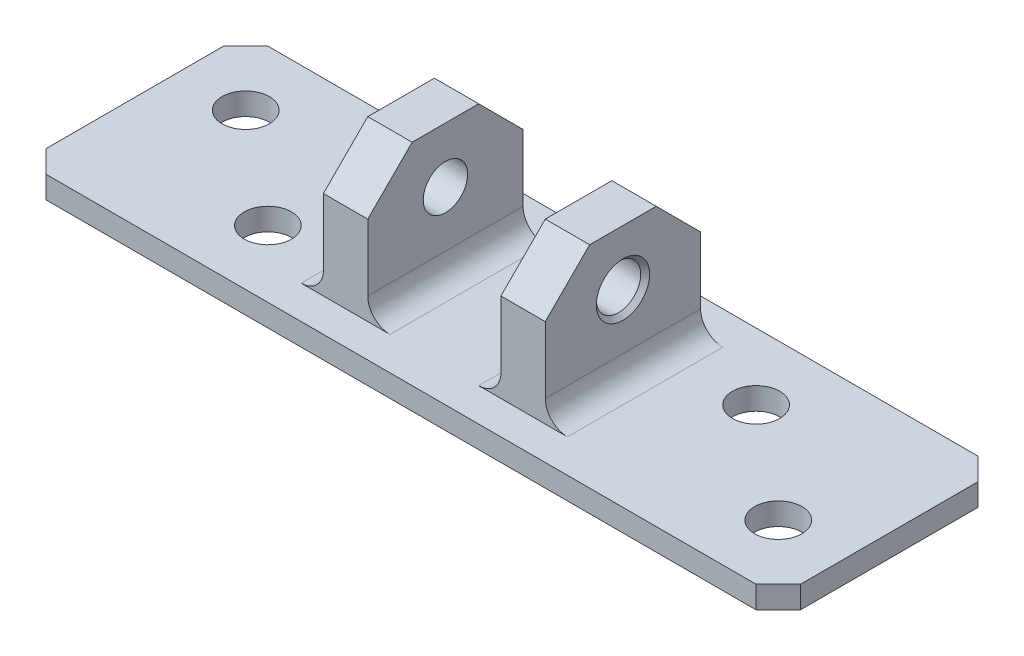
ISO-10303-21;
HEADER;
FILE_DESCRIPTION(('STEP AP214'),'2;1');
FILE_NAME('part.step','',(''),(''),'','','');
FILE_SCHEMA(('AUTOMOTIVE_DESIGN { 1 0 10303 214 1 1 1 1 }'));
ENDSEC;
DATA;
#1=APPLICATION_CONTEXT('core data for automotive mechanical design processes');
#2=APPLICATION_PROTOCOL_DEFINITION('international standard','automotive_design',2000,#1);
#3=PRODUCT_CONTEXT('',#1,'mechanical');
#4=PRODUCT('Part','Part','',(#3));
#5=PRODUCT_RELATED_PRODUCT_CATEGORY('part','',(#4));
#6=PRODUCT_DEFINITION_FORMATION('','',#4);
#7=PRODUCT_DEFINITION_CONTEXT('part definition',#1,'design');
#8=PRODUCT_DEFINITION('design','',#6,#7);
#9=PRODUCT_DEFINITION_SHAPE('','',#8);
#10=(LENGTH_UNIT() NAMED_UNIT(*) SI_UNIT(.MILLI.,.METRE.));
#11=(NAMED_UNIT(*) PLANE_ANGLE_UNIT() SI_UNIT($,.RADIAN.));
#12=(NAMED_UNIT(*) SI_UNIT($,.STERADIAN.) SOLID_ANGLE_UNIT());
#13=UNCERTAINTY_MEASURE_WITH_UNIT(LENGTH_MEASURE(1.E-05),#10,'distance_accuracy_value','');
#14=(GEOMETRIC_REPRESENTATION_CONTEXT(3) GLOBAL_UNCERTAINTY_ASSIGNED_CONTEXT((#13)) GLOBAL_UNIT_ASSIGNED_CONTEXT((#10,
#11,#12)) REPRESENTATION_CONTEXT('',''));
#15=CARTESIAN_POINT('',(0.,0.,0.));
#16=DIRECTION('',(0.,0.,1.));
#17=DIRECTION('',(1.,0.,0.));
#18=AXIS2_PLACEMENT_3D('',#15,#16,#17);
#19=CARTESIAN_POINT('',(0.,1.5875,0.));
#20=DIRECTION('',(0.,1.,0.));
#21=DIRECTION('',(0.,0.,1.));
#22=AXIS2_PLACEMENT_3D('',#19,#20,#21);
#23=PLANE('',#22);
#24=CARTESIAN_POINT('',(-44.45,1.5875,-6.35));
#25=DIRECTION('',(0.,1.,0.));
#26=DIRECTION('',(0.,0.,1.));
#27=AXIS2_PLACEMENT_3D('',#24,#25,#26);
#28=CIRCLE('',#27,3.3782);
#29=CARTESIAN_POINT('',(-44.45,1.5875,-2.9718));
#30=VERTEX_POINT('',#29);
#31=EDGE_CURVE('E399',#30,#30,#28,.T.);
#32=ORIENTED_EDGE('',*,*,#31,.F.);
#33=EDGE_LOOP('',(#32));
#34=FACE_BOUND('',#33,.T.);
#35=CARTESIAN_POINT('',(28.575,1.5875,-6.35000000000008));
#36=DIRECTION('',(0.,1.,0.));
#37=DIRECTION('',(0.,0.,1.));
#38=AXIS2_PLACEMENT_3D('',#35,#36,#37);
#39=CIRCLE('',#38,3.3782);
#40=CARTESIAN_POINT('',(28.575,1.5875,-2.97180000000008));
#41=VERTEX_POINT('',#40);
#42=EDGE_CURVE('E405',#41,#41,#39,.T.);
#43=ORIENTED_EDGE('',*,*,#42,.F.);
#44=EDGE_LOOP('',(#43));
#45=FACE_BOUND('',#44,.T.);
#46=CARTESIAN_POINT('',(-28.575,1.5875,6.35));
#47=DIRECTION('',(0.,1.,0.));
#48=DIRECTION('',(0.,0.,1.));
#49=AXIS2_PLACEMENT_3D('',#46,#47,#48);
#50=CIRCLE('',#49,3.3782);
#51=CARTESIAN_POINT('',(-28.575,1.5875,9.7282));
#52=VERTEX_POINT('',#51);
#53=EDGE_CURVE('E411',#52,#52,#50,.T.);
#54=ORIENTED_EDGE('',*,*,#53,.F.);
#55=EDGE_LOOP('',(#54));
#56=FACE_BOUND('',#55,.T.);
#57=CARTESIAN_POINT('',(44.45,1.5875,6.34999999999997));
#58=DIRECTION('',(0.,1.,0.));
#59=DIRECTION('',(0.,0.,1.));
#60=AXIS2_PLACEMENT_3D('',#57,#58,#59);
#61=CIRCLE('',#60,3.3782);
#62=CARTESIAN_POINT('',(44.45,1.5875,9.72819999999997));
#63=VERTEX_POINT('',#62);
#64=EDGE_CURVE('E417',#63,#63,#61,.T.);
#65=ORIENTED_EDGE('',*,*,#64,.F.);
#66=EDGE_LOOP('',(#65));
#67=FACE_BOUND('',#66,.T.);
#68=DIRECTION('',(0.,0.,1.));
#69=VECTOR('',#68,1.);
#70=CARTESIAN_POINT('',(-53.975,1.5875,15.875));
#71=LINE('',#70,#69);
#72=CARTESIAN_POINT('',(-53.975,1.5875,-12.7));
#73=VERTEX_POINT('',#72);
#74=CARTESIAN_POINT('',(-53.975,1.5875,12.7));
#75=VERTEX_POINT('',#74);
#76=EDGE_CURVE('E234',#73,#75,#71,.T.);
#77=ORIENTED_EDGE('',*,*,#76,.T.);
#78=DIRECTION('',(-0.707106781186546,0.,-0.707106781186549));
#79=VECTOR('',#78,1.);
#80=CARTESIAN_POINT('',(-33.3375000000001,1.5875,33.3375));
#81=LINE('',#80,#79);
#82=CARTESIAN_POINT('',(-50.8,1.5875,15.875));
#83=VERTEX_POINT('',#82);
#84=EDGE_CURVE('E249',#75,#83,#81,.F.);
#85=ORIENTED_EDGE('',*,*,#84,.T.);
#86=DIRECTION('',(1.,0.,0.));
#87=VECTOR('',#86,1.);
#88=CARTESIAN_POINT('',(53.975,1.5875,15.875));
#89=LINE('',#88,#87);
#90=CARTESIAN_POINT('',(50.8,1.5875,15.875));
#91=VERTEX_POINT('',#90);
#92=EDGE_CURVE('E215',#83,#91,#89,.T.);
#93=ORIENTED_EDGE('',*,*,#92,.T.);
#94=DIRECTION('',(-0.707106781186549,0.,0.707106781186546));
#95=VECTOR('',#94,1.);
#96=CARTESIAN_POINT('',(33.3374999999999,1.5875,33.3375));
#97=LINE('',#96,#95);
#98=CARTESIAN_POINT('',(53.975,1.5875,12.7));
#99=VERTEX_POINT('',#98);
#100=EDGE_CURVE('E245',#91,#99,#97,.F.);
#101=ORIENTED_EDGE('',*,*,#100,.T.);
#102=DIRECTION('',(0.,0.,-1.));
#103=VECTOR('',#102,1.);
#104=CARTESIAN_POINT('',(53.975,1.5875,15.875));
#105=LINE('',#104,#103);
#106=CARTESIAN_POINT('',(53.975,1.5875,-12.7));
#107=VERTEX_POINT('',#106);
#108=EDGE_CURVE('E425',#99,#107,#105,.T.);
#109=ORIENTED_EDGE('',*,*,#108,.T.);
#110=DIRECTION('',(0.707106781186544,0.,0.707106781186551));
#111=VECTOR('',#110,1.);
#112=CARTESIAN_POINT('',(33.3375000000002,1.5875,-33.3374999999999));
#113=LINE('',#112,#111);
#114=CARTESIAN_POINT('',(50.8,1.5875,-15.875));
#115=VERTEX_POINT('',#114);
#116=EDGE_CURVE('E243',#107,#115,#113,.F.);
#117=ORIENTED_EDGE('',*,*,#116,.T.);
#118=DIRECTION('',(-1.,0.,0.));
#119=VECTOR('',#118,1.);
#120=CARTESIAN_POINT('',(53.975,1.5875,-15.875));
#121=LINE('',#120,#119);
#122=CARTESIAN_POINT('',(-50.8,1.5875,-15.875));
#123=VERTEX_POINT('',#122);
#124=EDGE_CURVE('E235',#115,#123,#121,.T.);
#125=ORIENTED_EDGE('',*,*,#124,.T.);
#126=DIRECTION('',(0.707106781186549,0.,-0.707106781186546));
#127=VECTOR('',#126,1.);
#128=CARTESIAN_POINT('',(-33.3374999999999,1.5875,-33.3375));
#129=LINE('',#128,#127);
#130=EDGE_CURVE('E247',#123,#73,#129,.F.);
#131=ORIENTED_EDGE('',*,*,#130,.T.);
#132=EDGE_LOOP('',(#77,#85,#93,#101,#109,#117,#125,#131));
#133=FACE_BOUND('',#132,.T.);
#134=DIRECTION('',(-1.,0.,0.));
#135=VECTOR('',#134,1.);
#136=CARTESIAN_POINT('',(-9.525,1.5875,-11.1125));
#137=LINE('',#136,#135);
#138=CARTESIAN_POINT('',(-6.35,1.5875,-11.1125));
#139=VERTEX_POINT('',#138);
#140=CARTESIAN_POINT('',(-19.05,1.5875,-11.1125));
#141=VERTEX_POINT('',#140);
#142=EDGE_CURVE('E386',#139,#141,#137,.T.);
#143=ORIENTED_EDGE('',*,*,#142,.F.);
#144=DIRECTION('',(0.,0.,-1.));
#145=VECTOR('',#144,1.);
#146=CARTESIAN_POINT('',(-6.35,1.5875,0.));
#147=LINE('',#146,#145);
#148=CARTESIAN_POINT('',(-6.35,1.5875,11.1125));
#149=VERTEX_POINT('',#148);
#150=EDGE_CURVE('E267',#139,#149,#147,.F.);
#151=ORIENTED_EDGE('',*,*,#150,.T.);
#152=DIRECTION('',(1.,0.,0.));
#153=VECTOR('',#152,1.);
#154=CARTESIAN_POINT('',(-9.525,1.5875,11.1125));
#155=LINE('',#154,#153);
#156=CARTESIAN_POINT('',(-19.05,1.5875,11.1125));
#157=VERTEX_POINT('',#156);
#158=EDGE_CURVE('E357',#157,#149,#155,.T.);
#159=ORIENTED_EDGE('',*,*,#158,.F.);
#160=DIRECTION('',(0.,0.,1.));
#161=VECTOR('',#160,1.);
#162=CARTESIAN_POINT('',(-19.05,1.5875,0.));
#163=LINE('',#162,#161);
#164=EDGE_CURVE('E264',#157,#141,#163,.F.);
#165=ORIENTED_EDGE('',*,*,#164,.T.);
#166=EDGE_LOOP('',(#143,#151,#159,#165));
#167=FACE_BOUND('',#166,.T.);
#168=DIRECTION('',(-1.,0.,0.));
#169=VECTOR('',#168,1.);
#170=CARTESIAN_POINT('',(9.525,1.5875,-11.1125));
#171=LINE('',#170,#169);
#172=CARTESIAN_POINT('',(19.05,1.5875,-11.1125));
#173=VERTEX_POINT('',#172);
#174=CARTESIAN_POINT('',(6.35,1.5875,-11.1125));
#175=VERTEX_POINT('',#174);
#176=EDGE_CURVE('E373',#173,#175,#171,.T.);
#177=ORIENTED_EDGE('',*,*,#176,.F.);
#178=DIRECTION('',(0.,0.,-1.));
#179=VECTOR('',#178,1.);
#180=CARTESIAN_POINT('',(19.05,1.5875,0.));
#181=LINE('',#180,#179);
#182=CARTESIAN_POINT('',(19.05,1.5875,11.1125));
#183=VERTEX_POINT('',#182);
#184=EDGE_CURVE('E273',#173,#183,#181,.F.);
#185=ORIENTED_EDGE('',*,*,#184,.T.);
#186=DIRECTION('',(1.,0.,0.));
#187=VECTOR('',#186,1.);
#188=CARTESIAN_POINT('',(9.525,1.5875,11.1125));
#189=LINE('',#188,#187);
#190=CARTESIAN_POINT('',(6.35,1.5875,11.1125));
#191=VERTEX_POINT('',#190);
#192=EDGE_CURVE('E377',#191,#183,#189,.T.);
#193=ORIENTED_EDGE('',*,*,#192,.F.);
#194=DIRECTION('',(0.,0.,1.));
#195=VECTOR('',#194,1.);
#196=CARTESIAN_POINT('',(6.35,1.5875,0.));
#197=LINE('',#196,#195);
#198=EDGE_CURVE('E270',#191,#175,#197,.F.);
#199=ORIENTED_EDGE('',*,*,#198,.T.);
#200=EDGE_LOOP('',(#177,#185,#193,#199));
#201=FACE_BOUND('',#200,.T.);
#202=ADVANCED_FACE('F34',(#34,#45,#56,#67,#133,#167,#201),#23,.T.);
#203=CARTESIAN_POINT('',(-53.975,1.5875,15.875));
#204=DIRECTION('',(1.,0.,0.));
#205=DIRECTION('',(0.,0.,-1.));
#206=AXIS2_PLACEMENT_3D('',#203,#204,#205);
#207=PLANE('',#206);
#208=DIRECTION('',(0.,0.,1.));
#209=VECTOR('',#208,1.);
#210=CARTESIAN_POINT('',(-53.975,-1.5875,15.875));
#211=LINE('',#210,#209);
#212=CARTESIAN_POINT('',(-53.975,-1.5875,-12.7));
#213=VERTEX_POINT('',#212);
#214=CARTESIAN_POINT('',(-53.975,-1.5875,12.7));
#215=VERTEX_POINT('',#214);
#216=EDGE_CURVE('E223',#213,#215,#211,.T.);
#217=ORIENTED_EDGE('',*,*,#216,.T.);
#218=DIRECTION('',(0.,1.,0.));
#219=VECTOR('',#218,1.);
#220=CARTESIAN_POINT('',(-53.975,1.5875,12.7));
#221=LINE('',#220,#219);
#222=EDGE_CURVE('E200',#215,#75,#221,.T.);
#223=ORIENTED_EDGE('',*,*,#222,.T.);
#224=ORIENTED_EDGE('',*,*,#76,.F.);
#225=DIRECTION('',(0.,-1.,0.));
#226=VECTOR('',#225,1.);
#227=CARTESIAN_POINT('',(-53.975,1.5875,-12.7));
#228=LINE('',#227,#226);
#229=EDGE_CURVE('E205',#73,#213,#228,.T.);
#230=ORIENTED_EDGE('',*,*,#229,.T.);
#231=EDGE_LOOP('',(#217,#223,#224,#230));
#232=FACE_BOUND('',#231,.T.);
#233=ADVANCED_FACE('F441',(#232),#207,.F.);
#234=CARTESIAN_POINT('',(53.975,1.5875,15.875));
#235=DIRECTION('',(0.,0.,-1.));
#236=DIRECTION('',(-1.,0.,0.));
#237=AXIS2_PLACEMENT_3D('',#234,#235,#236);
#238=PLANE('',#237);
#239=ORIENTED_EDGE('',*,*,#92,.F.);
#240=DIRECTION('',(0.,-1.,0.));
#241=VECTOR('',#240,1.);
#242=CARTESIAN_POINT('',(-50.8,1.5875,15.875));
#243=LINE('',#242,#241);
#244=CARTESIAN_POINT('',(-50.8,-1.5875,15.875));
#245=VERTEX_POINT('',#244);
#246=EDGE_CURVE('E199',#83,#245,#243,.T.);
#247=ORIENTED_EDGE('',*,*,#246,.T.);
#248=DIRECTION('',(1.,0.,0.));
#249=VECTOR('',#248,1.);
#250=CARTESIAN_POINT('',(53.975,-1.5875,15.875));
#251=LINE('',#250,#249);
#252=CARTESIAN_POINT('',(50.8,-1.5875,15.875));
#253=VERTEX_POINT('',#252);
#254=EDGE_CURVE('E212',#245,#253,#251,.T.);
#255=ORIENTED_EDGE('',*,*,#254,.T.);
#256=DIRECTION('',(0.,1.,0.));
#257=VECTOR('',#256,1.);
#258=CARTESIAN_POINT('',(50.8,1.5875,15.875));
#259=LINE('',#258,#257);
#260=EDGE_CURVE('E217',#253,#91,#259,.T.);
#261=ORIENTED_EDGE('',*,*,#260,.T.);
#262=EDGE_LOOP('',(#239,#247,#255,#261));
#263=FACE_BOUND('',#262,.T.);
#264=ADVANCED_FACE('F211',(#263),#238,.F.);
#265=CARTESIAN_POINT('',(53.975,1.5875,15.875));
#266=DIRECTION('',(-1.,0.,0.));
#267=DIRECTION('',(0.,0.,1.));
#268=AXIS2_PLACEMENT_3D('',#265,#266,#267);
#269=PLANE('',#268);
#270=ORIENTED_EDGE('',*,*,#108,.F.);
#271=DIRECTION('',(0.,-1.,0.));
#272=VECTOR('',#271,1.);
#273=CARTESIAN_POINT('',(53.975,1.5875,12.7));
#274=LINE('',#273,#272);
#275=CARTESIAN_POINT('',(53.975,-1.5875,12.7));
#276=VERTEX_POINT('',#275);
#277=EDGE_CURVE('E258',#99,#276,#274,.T.);
#278=ORIENTED_EDGE('',*,*,#277,.T.);
#279=DIRECTION('',(0.,0.,-1.));
#280=VECTOR('',#279,1.);
#281=CARTESIAN_POINT('',(53.975,-1.5875,15.875));
#282=LINE('',#281,#280);
#283=CARTESIAN_POINT('',(53.975,-1.5875,-12.7));
#284=VERTEX_POINT('',#283);
#285=EDGE_CURVE('E222',#276,#284,#282,.T.);
#286=ORIENTED_EDGE('',*,*,#285,.T.);
#287=DIRECTION('',(0.,1.,0.));
#288=VECTOR('',#287,1.);
#289=CARTESIAN_POINT('',(53.975,1.5875,-12.7));
#290=LINE('',#289,#288);
#291=EDGE_CURVE('E256',#284,#107,#290,.T.);
#292=ORIENTED_EDGE('',*,*,#291,.T.);
#293=EDGE_LOOP('',(#270,#278,#286,#292));
#294=FACE_BOUND('',#293,.T.);
#295=ADVANCED_FACE('F449',(#294),#269,.F.);
#296=CARTESIAN_POINT('',(53.975,1.5875,-15.875));
#297=DIRECTION('',(0.,0.,1.));
#298=DIRECTION('',(1.,0.,0.));
#299=AXIS2_PLACEMENT_3D('',#296,#297,#298);
#300=PLANE('',#299);
#301=DIRECTION('',(-1.,0.,0.));
#302=VECTOR('',#301,1.);
#303=CARTESIAN_POINT('',(53.975,-1.5875,-15.875));
#304=LINE('',#303,#302);
#305=CARTESIAN_POINT('',(50.8,-1.5875,-15.875));
#306=VERTEX_POINT('',#305);
#307=CARTESIAN_POINT('',(-50.8,-1.5875,-15.875));
#308=VERTEX_POINT('',#307);
#309=EDGE_CURVE('E226',#306,#308,#304,.T.);
#310=ORIENTED_EDGE('',*,*,#309,.T.);
#311=DIRECTION('',(0.,1.,0.));
#312=VECTOR('',#311,1.);
#313=CARTESIAN_POINT('',(-50.8,1.5875,-15.875));
#314=LINE('',#313,#312);
#315=EDGE_CURVE('E254',#308,#123,#314,.T.);
#316=ORIENTED_EDGE('',*,*,#315,.T.);
#317=ORIENTED_EDGE('',*,*,#124,.F.);
#318=DIRECTION('',(0.,-1.,0.));
#319=VECTOR('',#318,1.);
#320=CARTESIAN_POINT('',(50.8,1.5875,-15.875));
#321=LINE('',#320,#319);
#322=EDGE_CURVE('E251',#115,#306,#321,.T.);
#323=ORIENTED_EDGE('',*,*,#322,.T.);
#324=EDGE_LOOP('',(#310,#316,#317,#323));
#325=FACE_BOUND('',#324,.T.);
#326=ADVANCED_FACE('F443',(#325),#300,.F.);
#327=CARTESIAN_POINT('',(0.,-1.5875,0.));
#328=DIRECTION('',(0.,1.,0.));
#329=DIRECTION('',(0.,0.,1.));
#330=AXIS2_PLACEMENT_3D('',#327,#328,#329);
#331=PLANE('',#330);
#332=CARTESIAN_POINT('',(-44.45,-1.5875,-6.35));
#333=DIRECTION('',(0.,1.,0.));
#334=DIRECTION('',(0.,0.,1.));
#335=AXIS2_PLACEMENT_3D('',#332,#333,#334);
#336=CIRCLE('',#335,3.3782);
#337=CARTESIAN_POINT('',(-44.45,-1.5875,-2.9718));
#338=VERTEX_POINT('',#337);
#339=EDGE_CURVE('E402',#338,#338,#336,.T.);
#340=ORIENTED_EDGE('',*,*,#339,.T.);
#341=EDGE_LOOP('',(#340));
#342=FACE_BOUND('',#341,.T.);
#343=CARTESIAN_POINT('',(28.575,-1.5875,-6.35000000000008));
#344=DIRECTION('',(0.,1.,0.));
#345=DIRECTION('',(0.,0.,1.));
#346=AXIS2_PLACEMENT_3D('',#343,#344,#345);
#347=CIRCLE('',#346,3.3782);
#348=CARTESIAN_POINT('',(28.575,-1.5875,-2.97180000000008));
#349=VERTEX_POINT('',#348);
#350=EDGE_CURVE('E408',#349,#349,#347,.T.);
#351=ORIENTED_EDGE('',*,*,#350,.T.);
#352=EDGE_LOOP('',(#351));
#353=FACE_BOUND('',#352,.T.);
#354=CARTESIAN_POINT('',(-28.575,-1.5875,6.35));
#355=DIRECTION('',(0.,1.,0.));
#356=DIRECTION('',(0.,0.,1.));
#357=AXIS2_PLACEMENT_3D('',#354,#355,#356);
#358=CIRCLE('',#357,3.3782);
#359=CARTESIAN_POINT('',(-28.575,-1.5875,9.7282));
#360=VERTEX_POINT('',#359);
#361=EDGE_CURVE('E414',#360,#360,#358,.T.);
#362=ORIENTED_EDGE('',*,*,#361,.T.);
#363=EDGE_LOOP('',(#362));
#364=FACE_BOUND('',#363,.T.);
#365=CARTESIAN_POINT('',(44.45,-1.5875,6.34999999999997));
#366=DIRECTION('',(0.,1.,0.));
#367=DIRECTION('',(0.,0.,1.));
#368=AXIS2_PLACEMENT_3D('',#365,#366,#367);
#369=CIRCLE('',#368,3.3782);
#370=CARTESIAN_POINT('',(44.45,-1.5875,9.72819999999997));
#371=VERTEX_POINT('',#370);
#372=EDGE_CURVE('E228',#371,#371,#369,.T.);
#373=ORIENTED_EDGE('',*,*,#372,.T.);
#374=EDGE_LOOP('',(#373));
#375=FACE_BOUND('',#374,.T.);
#376=ORIENTED_EDGE('',*,*,#254,.F.);
#377=DIRECTION('',(0.707106781186546,0.,0.707106781186549));
#378=VECTOR('',#377,1.);
#379=CARTESIAN_POINT('',(-50.8,-1.5875,15.875));
#380=LINE('',#379,#378);
#381=EDGE_CURVE('E195',#245,#215,#380,.F.);
#382=ORIENTED_EDGE('',*,*,#381,.T.);
#383=ORIENTED_EDGE('',*,*,#216,.F.);
#384=DIRECTION('',(-0.707106781186549,0.,0.707106781186546));
#385=VECTOR('',#384,1.);
#386=CARTESIAN_POINT('',(-53.975,-1.5875,-12.7));
#387=LINE('',#386,#385);
#388=EDGE_CURVE('E206',#213,#308,#387,.F.);
#389=ORIENTED_EDGE('',*,*,#388,.T.);
#390=ORIENTED_EDGE('',*,*,#309,.F.);
#391=DIRECTION('',(-0.707106781186544,0.,-0.707106781186551));
#392=VECTOR('',#391,1.);
#393=CARTESIAN_POINT('',(50.8,-1.5875,-15.875));
#394=LINE('',#393,#392);
#395=EDGE_CURVE('E216',#306,#284,#394,.F.);
#396=ORIENTED_EDGE('',*,*,#395,.T.);
#397=ORIENTED_EDGE('',*,*,#285,.F.);
#398=DIRECTION('',(0.707106781186549,0.,-0.707106781186546));
#399=VECTOR('',#398,1.);
#400=CARTESIAN_POINT('',(53.975,-1.5875,12.7));
#401=LINE('',#400,#399);
#402=EDGE_CURVE('E221',#276,#253,#401,.F.);
#403=ORIENTED_EDGE('',*,*,#402,.T.);
#404=EDGE_LOOP('',(#376,#382,#383,#389,#390,#396,#397,#403));
#405=FACE_BOUND('',#404,.T.);
#406=ADVANCED_FACE('F219',(#342,#353,#364,#375,#405),#331,.F.);
#407=CARTESIAN_POINT('',(44.45,1.5875,6.34999999999997));
#408=DIRECTION('',(0.,1.,0.));
#409=DIRECTION('',(0.,0.,1.));
#410=AXIS2_PLACEMENT_3D('',#407,#408,#409);
#411=CYLINDRICAL_SURFACE('',#410,3.3782);
#412=ORIENTED_EDGE('',*,*,#372,.F.);
#413=EDGE_LOOP('',(#412));
#414=FACE_BOUND('',#413,.T.);
#415=ORIENTED_EDGE('',*,*,#64,.T.);
#416=EDGE_LOOP('',(#415));
#417=FACE_BOUND('',#416,.T.);
#418=ADVANCED_FACE('F474',(#414,#417),#411,.F.);
#419=CARTESIAN_POINT('',(-28.575,1.5875,6.35));
#420=DIRECTION('',(0.,1.,0.));
#421=DIRECTION('',(0.,0.,1.));
#422=AXIS2_PLACEMENT_3D('',#419,#420,#421);
#423=CYLINDRICAL_SURFACE('',#422,3.3782);
#424=ORIENTED_EDGE('',*,*,#361,.F.);
#425=EDGE_LOOP('',(#424));
#426=FACE_BOUND('',#425,.T.);
#427=ORIENTED_EDGE('',*,*,#53,.T.);
#428=EDGE_LOOP('',(#427));
#429=FACE_BOUND('',#428,.T.);
#430=ADVANCED_FACE('F533',(#426,#429),#423,.F.);
#431=CARTESIAN_POINT('',(28.575,1.5875,-6.35000000000008));
#432=DIRECTION('',(0.,1.,0.));
#433=DIRECTION('',(0.,0.,1.));
#434=AXIS2_PLACEMENT_3D('',#431,#432,#433);
#435=CYLINDRICAL_SURFACE('',#434,3.3782);
#436=ORIENTED_EDGE('',*,*,#350,.F.);
#437=EDGE_LOOP('',(#436));
#438=FACE_BOUND('',#437,.T.);
#439=ORIENTED_EDGE('',*,*,#42,.T.);
#440=EDGE_LOOP('',(#439));
#441=FACE_BOUND('',#440,.T.);
#442=ADVANCED_FACE('F530',(#438,#441),#435,.F.);
#443=CARTESIAN_POINT('',(-44.45,1.5875,-6.35));
#444=DIRECTION('',(0.,1.,0.));
#445=DIRECTION('',(0.,0.,1.));
#446=AXIS2_PLACEMENT_3D('',#443,#444,#445);
#447=CYLINDRICAL_SURFACE('',#446,3.3782);
#448=ORIENTED_EDGE('',*,*,#339,.F.);
#449=EDGE_LOOP('',(#448));
#450=FACE_BOUND('',#449,.T.);
#451=ORIENTED_EDGE('',*,*,#31,.T.);
#452=EDGE_LOOP('',(#451));
#453=FACE_BOUND('',#452,.T.);
#454=ADVANCED_FACE('F526',(#450,#453),#447,.F.);
#455=CARTESIAN_POINT('',(-15.875,20.6375,11.1125));
#456=DIRECTION('',(1.,0.,0.));
#457=DIRECTION('',(0.,0.,-1.));
#458=AXIS2_PLACEMENT_3D('',#455,#456,#457);
#459=PLANE('',#458);
#460=CARTESIAN_POINT('',(-15.875,12.7,2.16840434497101E-13));
#461=DIRECTION('',(1.,0.,0.));
#462=DIRECTION('',(0.,0.,-1.));
#463=AXIS2_PLACEMENT_3D('',#460,#461,#462);
#464=CIRCLE('',#463,3.80999999999999);
#465=CARTESIAN_POINT('',(-15.875,12.7,-3.80999999999977));
#466=VERTEX_POINT('',#465);
#467=EDGE_CURVE('E763',#466,#466,#464,.T.);
#468=ORIENTED_EDGE('',*,*,#467,.T.);
#469=EDGE_LOOP('',(#468));
#470=FACE_BOUND('',#469,.T.);
#471=DIRECTION('',(0.,0.,1.));
#472=VECTOR('',#471,1.);
#473=CARTESIAN_POINT('',(-15.875,20.6375,11.1125));
#474=LINE('',#473,#472);
#475=CARTESIAN_POINT('',(-15.875,20.6375,-4.7625));
#476=VERTEX_POINT('',#475);
#477=CARTESIAN_POINT('',(-15.875,20.6375,4.76249999999999));
#478=VERTEX_POINT('',#477);
#479=EDGE_CURVE('E382',#476,#478,#474,.T.);
#480=ORIENTED_EDGE('',*,*,#479,.F.);
#481=DIRECTION('',(0.,-0.707106781186549,-0.707106781186546));
#482=VECTOR('',#481,1.);
#483=CARTESIAN_POINT('',(-15.875,20.6375,-4.7625));
#484=LINE('',#483,#482);
#485=CARTESIAN_POINT('',(-15.875,14.2875,-11.1125));
#486=VERTEX_POINT('',#485);
#487=EDGE_CURVE('E322',#476,#486,#484,.T.);
#488=ORIENTED_EDGE('',*,*,#487,.T.);
#489=DIRECTION('',(0.,-1.,0.));
#490=VECTOR('',#489,1.);
#491=CARTESIAN_POINT('',(-15.875,20.6375,-11.1125));
#492=LINE('',#491,#490);
#493=CARTESIAN_POINT('',(-15.875,4.76250000000001,-11.1125));
#494=VERTEX_POINT('',#493);
#495=EDGE_CURVE('E389',#486,#494,#492,.T.);
#496=ORIENTED_EDGE('',*,*,#495,.T.);
#497=DIRECTION('',(0.,0.,1.));
#498=VECTOR('',#497,1.);
#499=CARTESIAN_POINT('',(-15.875,4.7625,11.1125));
#500=LINE('',#499,#498);
#501=CARTESIAN_POINT('',(-15.875,4.76250000000001,11.1125));
#502=VERTEX_POINT('',#501);
#503=EDGE_CURVE('E282',#494,#502,#500,.T.);
#504=ORIENTED_EDGE('',*,*,#503,.T.);
#505=DIRECTION('',(0.,-1.,0.));
#506=VECTOR('',#505,1.);
#507=CARTESIAN_POINT('',(-15.875,20.6375,11.1125));
#508=LINE('',#507,#506);
#509=CARTESIAN_POINT('',(-15.875,14.2875,11.1125));
#510=VERTEX_POINT('',#509);
#511=EDGE_CURVE('E397',#510,#502,#508,.T.);
#512=ORIENTED_EDGE('',*,*,#511,.F.);
#513=DIRECTION('',(0.,0.707106781186549,-0.707106781186546));
#514=VECTOR('',#513,1.);
#515=CARTESIAN_POINT('',(-15.875,20.6375,4.76249999999999));
#516=LINE('',#515,#514);
#517=EDGE_CURVE('E320',#510,#478,#516,.T.);
#518=ORIENTED_EDGE('',*,*,#517,.T.);
#519=EDGE_LOOP('',(#480,#488,#496,#504,#512,#518));
#520=FACE_BOUND('',#519,.T.);
#521=ADVANCED_FACE('F522',(#470,#520),#459,.F.);
#522=CARTESIAN_POINT('',(-9.525,20.6375,11.1125));
#523=DIRECTION('',(0.,0.,-1.));
#524=DIRECTION('',(-1.,0.,0.));
#525=AXIS2_PLACEMENT_3D('',#522,#523,#524);
#526=PLANE('',#525);
#527=DIRECTION('',(0.,-1.,0.));
#528=VECTOR('',#527,1.);
#529=CARTESIAN_POINT('',(-9.525,20.6375,11.1125));
#530=LINE('',#529,#528);
#531=CARTESIAN_POINT('',(-9.525,14.2875,11.1125));
#532=VERTEX_POINT('',#531);
#533=CARTESIAN_POINT('',(-9.525,4.76250000000001,11.1125));
#534=VERTEX_POINT('',#533);
#535=EDGE_CURVE('E395',#532,#534,#530,.T.);
#536=ORIENTED_EDGE('',*,*,#535,.F.);
#537=DIRECTION('',(-1.,0.,0.));
#538=VECTOR('',#537,1.);
#539=CARTESIAN_POINT('',(-15.875,14.2875,11.1125));
#540=LINE('',#539,#538);
#541=EDGE_CURVE('E11',#532,#510,#540,.T.);
#542=ORIENTED_EDGE('',*,*,#541,.T.);
#543=ORIENTED_EDGE('',*,*,#511,.T.);
#544=CARTESIAN_POINT('',(-19.05,4.7625,11.1125));
#545=DIRECTION('',(0.,0.,-1.));
#546=DIRECTION('',(-1.,0.,0.));
#547=AXIS2_PLACEMENT_3D('',#544,#545,#546);
#548=CIRCLE('',#547,3.175);
#549=EDGE_CURVE('E303',#502,#157,#548,.T.);
#550=ORIENTED_EDGE('',*,*,#549,.T.);
#551=ORIENTED_EDGE('',*,*,#158,.T.);
#552=CARTESIAN_POINT('',(-6.35,4.7625,11.1125));
#553=DIRECTION('',(0.,0.,-1.));
#554=DIRECTION('',(-1.,0.,0.));
#555=AXIS2_PLACEMENT_3D('',#552,#553,#554);
#556=CIRCLE('',#555,3.175);
#557=EDGE_CURVE('E300',#149,#534,#556,.T.);
#558=ORIENTED_EDGE('',*,*,#557,.T.);
#559=EDGE_LOOP('',(#536,#542,#543,#550,#551,#558));
#560=FACE_BOUND('',#559,.T.);
#561=ADVANCED_FACE('F518',(#560),#526,.F.);
#562=CARTESIAN_POINT('',(-9.525,20.6375,11.1125));
#563=DIRECTION('',(-1.,0.,0.));
#564=DIRECTION('',(0.,0.,1.));
#565=AXIS2_PLACEMENT_3D('',#562,#563,#564);
#566=PLANE('',#565);
#567=CARTESIAN_POINT('',(-9.525,12.7,1.73472347597681E-13));
#568=DIRECTION('',(-1.,0.,0.));
#569=DIRECTION('',(0.,0.,1.));
#570=AXIS2_PLACEMENT_3D('',#567,#568,#569);
#571=CIRCLE('',#570,3.175);
#572=CARTESIAN_POINT('',(-9.525,12.7,3.17500000000017));
#573=VERTEX_POINT('',#572);
#574=EDGE_CURVE('E313',#573,#573,#571,.T.);
#575=ORIENTED_EDGE('',*,*,#574,.T.);
#576=EDGE_LOOP('',(#575));
#577=FACE_BOUND('',#576,.T.);
#578=DIRECTION('',(0.,-1.,0.));
#579=VECTOR('',#578,1.);
#580=CARTESIAN_POINT('',(-9.525,20.6375,-11.1125));
#581=LINE('',#580,#579);
#582=CARTESIAN_POINT('',(-9.525,14.2875,-11.1125));
#583=VERTEX_POINT('',#582);
#584=CARTESIAN_POINT('',(-9.525,4.76250000000001,-11.1125));
#585=VERTEX_POINT('',#584);
#586=EDGE_CURVE('E393',#583,#585,#581,.T.);
#587=ORIENTED_EDGE('',*,*,#586,.F.);
#588=DIRECTION('',(0.,0.707106781186549,0.707106781186546));
#589=VECTOR('',#588,1.);
#590=CARTESIAN_POINT('',(-9.525,20.6375,-4.7625));
#591=LINE('',#590,#589);
#592=CARTESIAN_POINT('',(-9.525,20.6375,-4.7625));
#593=VERTEX_POINT('',#592);
#594=EDGE_CURVE('E328',#583,#593,#591,.T.);
#595=ORIENTED_EDGE('',*,*,#594,.T.);
#596=DIRECTION('',(0.,0.,-1.));
#597=VECTOR('',#596,1.);
#598=CARTESIAN_POINT('',(-9.525,20.6375,11.1125));
#599=LINE('',#598,#597);
#600=CARTESIAN_POINT('',(-9.525,20.6375,4.76249999999999));
#601=VERTEX_POINT('',#600);
#602=EDGE_CURVE('E385',#601,#593,#599,.T.);
#603=ORIENTED_EDGE('',*,*,#602,.F.);
#604=DIRECTION('',(0.,-0.707106781186549,0.707106781186546));
#605=VECTOR('',#604,1.);
#606=CARTESIAN_POINT('',(-9.525,20.6375,4.76249999999999));
#607=LINE('',#606,#605);
#608=EDGE_CURVE('E326',#601,#532,#607,.T.);
#609=ORIENTED_EDGE('',*,*,#608,.T.);
#610=ORIENTED_EDGE('',*,*,#535,.T.);
#611=DIRECTION('',(0.,0.,-1.));
#612=VECTOR('',#611,1.);
#613=CARTESIAN_POINT('',(-9.525,4.7625,11.1125));
#614=LINE('',#613,#612);
#615=EDGE_CURVE('E279',#534,#585,#614,.T.);
#616=ORIENTED_EDGE('',*,*,#615,.T.);
#617=EDGE_LOOP('',(#587,#595,#603,#609,#610,#616));
#618=FACE_BOUND('',#617,.T.);
#619=ADVANCED_FACE('F514',(#577,#618),#566,.F.);
#620=CARTESIAN_POINT('',(-9.525,20.6375,-11.1125));
#621=DIRECTION('',(0.,0.,1.));
#622=DIRECTION('',(1.,0.,0.));
#623=AXIS2_PLACEMENT_3D('',#620,#621,#622);
#624=PLANE('',#623);
#625=ORIENTED_EDGE('',*,*,#495,.F.);
#626=DIRECTION('',(1.,0.,0.));
#627=VECTOR('',#626,1.);
#628=CARTESIAN_POINT('',(-9.525,14.2875,-11.1125));
#629=LINE('',#628,#627);
#630=EDGE_CURVE('E324',#486,#583,#629,.T.);
#631=ORIENTED_EDGE('',*,*,#630,.T.);
#632=ORIENTED_EDGE('',*,*,#586,.T.);
#633=CARTESIAN_POINT('',(-6.35,4.7625,-11.1125));
#634=DIRECTION('',(0.,0.,1.));
#635=DIRECTION('',(1.,0.,0.));
#636=AXIS2_PLACEMENT_3D('',#633,#634,#635);
#637=CIRCLE('',#636,3.175);
#638=EDGE_CURVE('E297',#585,#139,#637,.T.);
#639=ORIENTED_EDGE('',*,*,#638,.T.);
#640=ORIENTED_EDGE('',*,*,#142,.T.);
#641=CARTESIAN_POINT('',(-19.05,4.7625,-11.1125));
#642=DIRECTION('',(0.,0.,1.));
#643=DIRECTION('',(1.,0.,0.));
#644=AXIS2_PLACEMENT_3D('',#641,#642,#643);
#645=CIRCLE('',#644,3.175);
#646=EDGE_CURVE('E306',#141,#494,#645,.T.);
#647=ORIENTED_EDGE('',*,*,#646,.T.);
#648=EDGE_LOOP('',(#625,#631,#632,#639,#640,#647));
#649=FACE_BOUND('',#648,.T.);
#650=ADVANCED_FACE('F510',(#649),#624,.F.);
#651=CARTESIAN_POINT('',(0.,20.6375,0.));
#652=DIRECTION('',(0.,1.,0.));
#653=DIRECTION('',(0.,0.,1.));
#654=AXIS2_PLACEMENT_3D('',#651,#652,#653);
#655=PLANE('',#654);
#656=ORIENTED_EDGE('',*,*,#602,.T.);
#657=DIRECTION('',(-1.,0.,0.));
#658=VECTOR('',#657,1.);
#659=CARTESIAN_POINT('',(-15.875,20.6375,-4.7625));
#660=LINE('',#659,#658);
#661=EDGE_CURVE('E317',#593,#476,#660,.T.);
#662=ORIENTED_EDGE('',*,*,#661,.T.);
#663=ORIENTED_EDGE('',*,*,#479,.T.);
#664=DIRECTION('',(1.,0.,0.));
#665=VECTOR('',#664,1.);
#666=CARTESIAN_POINT('',(-9.525,20.6375,4.76249999999999));
#667=LINE('',#666,#665);
#668=EDGE_CURVE('E309',#478,#601,#667,.T.);
#669=ORIENTED_EDGE('',*,*,#668,.T.);
#670=EDGE_LOOP('',(#656,#662,#663,#669));
#671=FACE_BOUND('',#670,.T.);
#672=ADVANCED_FACE('F506',(#671),#655,.T.);
#673=CARTESIAN_POINT('',(9.525,20.6375,11.1125));
#674=DIRECTION('',(1.,0.,0.));
#675=DIRECTION('',(0.,0.,-1.));
#676=AXIS2_PLACEMENT_3D('',#673,#674,#675);
#677=PLANE('',#676);
#678=CARTESIAN_POINT('',(9.525,12.7,0.));
#679=DIRECTION('',(1.,0.,0.));
#680=DIRECTION('',(0.,0.,-1.));
#681=AXIS2_PLACEMENT_3D('',#678,#679,#680);
#682=CIRCLE('',#681,3.175);
#683=CARTESIAN_POINT('',(9.525,12.7,-3.17499999999995));
#684=VERTEX_POINT('',#683);
#685=EDGE_CURVE('E310',#684,#684,#682,.T.);
#686=ORIENTED_EDGE('',*,*,#685,.T.);
#687=EDGE_LOOP('',(#686));
#688=FACE_BOUND('',#687,.T.);
#689=DIRECTION('',(0.,0.,1.));
#690=VECTOR('',#689,1.);
#691=CARTESIAN_POINT('',(9.525,20.6375,11.1125));
#692=LINE('',#691,#690);
#693=CARTESIAN_POINT('',(9.525,20.6375,-4.7625));
#694=VERTEX_POINT('',#693);
#695=CARTESIAN_POINT('',(9.525,20.6375,4.76249999999999));
#696=VERTEX_POINT('',#695);
#697=EDGE_CURVE('E366',#694,#696,#692,.T.);
#698=ORIENTED_EDGE('',*,*,#697,.F.);
#699=DIRECTION('',(0.,0.707106781186549,0.707106781186546));
#700=VECTOR('',#699,1.);
#701=CARTESIAN_POINT('',(9.525,20.6375,-4.7625));
#702=LINE('',#701,#700);
#703=CARTESIAN_POINT('',(9.525,14.2875,-11.1125));
#704=VERTEX_POINT('',#703);
#705=EDGE_CURVE('E338',#694,#704,#702,.F.);
#706=ORIENTED_EDGE('',*,*,#705,.T.);
#707=DIRECTION('',(0.,-1.,0.));
#708=VECTOR('',#707,1.);
#709=CARTESIAN_POINT('',(9.525,20.6375,-11.1125));
#710=LINE('',#709,#708);
#711=CARTESIAN_POINT('',(9.525,4.76250000000001,-11.1125));
#712=VERTEX_POINT('',#711);
#713=EDGE_CURVE('E369',#704,#712,#710,.T.);
#714=ORIENTED_EDGE('',*,*,#713,.T.);
#715=DIRECTION('',(0.,0.,1.));
#716=VECTOR('',#715,1.);
#717=CARTESIAN_POINT('',(9.525,4.7625,11.1125));
#718=LINE('',#717,#716);
#719=CARTESIAN_POINT('',(9.525,4.76250000000001,11.1125));
#720=VERTEX_POINT('',#719);
#721=EDGE_CURVE('E276',#712,#720,#718,.T.);
#722=ORIENTED_EDGE('',*,*,#721,.T.);
#723=DIRECTION('',(0.,-1.,0.));
#724=VECTOR('',#723,1.);
#725=CARTESIAN_POINT('',(9.525,20.6375,11.1125));
#726=LINE('',#725,#724);
#727=CARTESIAN_POINT('',(9.525,14.2875,11.1125));
#728=VERTEX_POINT('',#727);
#729=EDGE_CURVE('E347',#728,#720,#726,.T.);
#730=ORIENTED_EDGE('',*,*,#729,.F.);
#731=DIRECTION('',(0.,-0.707106781186549,0.707106781186546));
#732=VECTOR('',#731,1.);
#733=CARTESIAN_POINT('',(9.525,20.6375,4.76249999999999));
#734=LINE('',#733,#732);
#735=EDGE_CURVE('E336',#728,#696,#734,.F.);
#736=ORIENTED_EDGE('',*,*,#735,.T.);
#737=EDGE_LOOP('',(#698,#706,#714,#722,#730,#736));
#738=FACE_BOUND('',#737,.T.);
#739=ADVANCED_FACE('F354',(#688,#738),#677,.F.);
#740=CARTESIAN_POINT('',(9.525,20.6375,11.1125));
#741=DIRECTION('',(0.,0.,-1.));
#742=DIRECTION('',(-1.,0.,0.));
#743=AXIS2_PLACEMENT_3D('',#740,#741,#742);
#744=PLANE('',#743);
#745=DIRECTION('',(0.,-1.,0.));
#746=VECTOR('',#745,1.);
#747=CARTESIAN_POINT('',(15.875,20.6375,11.1125));
#748=LINE('',#747,#746);
#749=CARTESIAN_POINT('',(15.875,14.2875,11.1125));
#750=VERTEX_POINT('',#749);
#751=CARTESIAN_POINT('',(15.875,4.76250000000001,11.1125));
#752=VERTEX_POINT('',#751);
#753=EDGE_CURVE('E349',#750,#752,#748,.T.);
#754=ORIENTED_EDGE('',*,*,#753,.F.);
#755=DIRECTION('',(-1.,0.,0.));
#756=VECTOR('',#755,1.);
#757=CARTESIAN_POINT('',(9.525,14.2875,11.1125));
#758=LINE('',#757,#756);
#759=EDGE_CURVE('E42',#750,#728,#758,.T.);
#760=ORIENTED_EDGE('',*,*,#759,.T.);
#761=ORIENTED_EDGE('',*,*,#729,.T.);
#762=CARTESIAN_POINT('',(6.35,4.7625,11.1125));
#763=DIRECTION('',(0.,0.,-1.));
#764=DIRECTION('',(-1.,0.,0.));
#765=AXIS2_PLACEMENT_3D('',#762,#763,#764);
#766=CIRCLE('',#765,3.175);
#767=EDGE_CURVE('E291',#720,#191,#766,.T.);
#768=ORIENTED_EDGE('',*,*,#767,.T.);
#769=ORIENTED_EDGE('',*,*,#192,.T.);
#770=CARTESIAN_POINT('',(19.05,4.7625,11.1125));
#771=DIRECTION('',(0.,0.,-1.));
#772=DIRECTION('',(-1.,0.,0.));
#773=AXIS2_PLACEMENT_3D('',#770,#771,#772);
#774=CIRCLE('',#773,3.175);
#775=EDGE_CURVE('E288',#183,#752,#774,.T.);
#776=ORIENTED_EDGE('',*,*,#775,.T.);
#777=EDGE_LOOP('',(#754,#760,#761,#768,#769,#776));
#778=FACE_BOUND('',#777,.T.);
#779=ADVANCED_FACE('F346',(#778),#744,.F.);
#780=CARTESIAN_POINT('',(15.875,20.6375,11.1125));
#781=DIRECTION('',(-1.,0.,0.));
#782=DIRECTION('',(0.,0.,1.));
#783=AXIS2_PLACEMENT_3D('',#780,#781,#782);
#784=PLANE('',#783);
#785=CARTESIAN_POINT('',(15.875,12.7,0.));
#786=DIRECTION('',(1.,0.,0.));
#787=DIRECTION('',(0.,0.,-1.));
#788=AXIS2_PLACEMENT_3D('',#785,#786,#787);
#789=CIRCLE('',#788,3.81);
#790=CARTESIAN_POINT('',(15.875,12.7,-3.81));
#791=VERTEX_POINT('',#790);
#792=EDGE_CURVE('E760',#791,#791,#789,.T.);
#793=ORIENTED_EDGE('',*,*,#792,.F.);
#794=EDGE_LOOP('',(#793));
#795=FACE_BOUND('',#794,.T.);
#796=DIRECTION('',(0.,-1.,0.));
#797=VECTOR('',#796,1.);
#798=CARTESIAN_POINT('',(15.875,20.6375,-11.1125));
#799=LINE('',#798,#797);
#800=CARTESIAN_POINT('',(15.875,14.2875,-11.1125));
#801=VERTEX_POINT('',#800);
#802=CARTESIAN_POINT('',(15.875,4.76250000000001,-11.1125));
#803=VERTEX_POINT('',#802);
#804=EDGE_CURVE('E371',#801,#803,#799,.T.);
#805=ORIENTED_EDGE('',*,*,#804,.F.);
#806=DIRECTION('',(0.,-0.707106781186549,-0.707106781186546));
#807=VECTOR('',#806,1.);
#808=CARTESIAN_POINT('',(15.875,20.6375,-4.7625));
#809=LINE('',#808,#807);
#810=CARTESIAN_POINT('',(15.875,20.6375,-4.7625));
#811=VERTEX_POINT('',#810);
#812=EDGE_CURVE('E342',#801,#811,#809,.F.);
#813=ORIENTED_EDGE('',*,*,#812,.T.);
#814=DIRECTION('',(0.,0.,-1.));
#815=VECTOR('',#814,1.);
#816=CARTESIAN_POINT('',(15.875,20.6375,11.1125));
#817=LINE('',#816,#815);
#818=CARTESIAN_POINT('',(15.875,20.6375,4.76249999999999));
#819=VERTEX_POINT('',#818);
#820=EDGE_CURVE('E364',#819,#811,#817,.T.);
#821=ORIENTED_EDGE('',*,*,#820,.F.);
#822=DIRECTION('',(0.,0.707106781186549,-0.707106781186546));
#823=VECTOR('',#822,1.);
#824=CARTESIAN_POINT('',(15.875,20.6375,4.76249999999999));
#825=LINE('',#824,#823);
#826=EDGE_CURVE('E49',#819,#750,#825,.F.);
#827=ORIENTED_EDGE('',*,*,#826,.T.);
#828=ORIENTED_EDGE('',*,*,#753,.T.);
#829=DIRECTION('',(0.,0.,-1.));
#830=VECTOR('',#829,1.);
#831=CARTESIAN_POINT('',(15.875,4.7625,11.1125));
#832=LINE('',#831,#830);
#833=EDGE_CURVE('E261',#752,#803,#832,.T.);
#834=ORIENTED_EDGE('',*,*,#833,.T.);
#835=EDGE_LOOP('',(#805,#813,#821,#827,#828,#834));
#836=FACE_BOUND('',#835,.T.);
#837=ADVANCED_FACE('F367',(#795,#836),#784,.F.);
#838=CARTESIAN_POINT('',(9.525,20.6375,-11.1125));
#839=DIRECTION('',(0.,0.,1.));
#840=DIRECTION('',(1.,0.,0.));
#841=AXIS2_PLACEMENT_3D('',#838,#839,#840);
#842=PLANE('',#841);
#843=ORIENTED_EDGE('',*,*,#713,.F.);
#844=DIRECTION('',(1.,0.,0.));
#845=VECTOR('',#844,1.);
#846=CARTESIAN_POINT('',(9.525,14.2875,-11.1125));
#847=LINE('',#846,#845);
#848=EDGE_CURVE('E57',#704,#801,#847,.T.);
#849=ORIENTED_EDGE('',*,*,#848,.T.);
#850=ORIENTED_EDGE('',*,*,#804,.T.);
#851=CARTESIAN_POINT('',(19.05,4.7625,-11.1125));
#852=DIRECTION('',(0.,0.,1.));
#853=DIRECTION('',(1.,0.,0.));
#854=AXIS2_PLACEMENT_3D('',#851,#852,#853);
#855=CIRCLE('',#854,3.175);
#856=EDGE_CURVE('E285',#803,#173,#855,.T.);
#857=ORIENTED_EDGE('',*,*,#856,.T.);
#858=ORIENTED_EDGE('',*,*,#176,.T.);
#859=CARTESIAN_POINT('',(6.35,4.7625,-11.1125));
#860=DIRECTION('',(0.,0.,1.));
#861=DIRECTION('',(1.,0.,0.));
#862=AXIS2_PLACEMENT_3D('',#859,#860,#861);
#863=CIRCLE('',#862,3.175);
#864=EDGE_CURVE('E294',#175,#712,#863,.T.);
#865=ORIENTED_EDGE('',*,*,#864,.T.);
#866=EDGE_LOOP('',(#843,#849,#850,#857,#858,#865));
#867=FACE_BOUND('',#866,.T.);
#868=ADVANCED_FACE('F489',(#867),#842,.F.);
#869=CARTESIAN_POINT('',(0.,20.6375,0.));
#870=DIRECTION('',(0.,-1.,0.));
#871=DIRECTION('',(0.,0.,-1.));
#872=AXIS2_PLACEMENT_3D('',#869,#870,#871);
#873=PLANE('',#872);
#874=ORIENTED_EDGE('',*,*,#820,.T.);
#875=DIRECTION('',(-1.,0.,0.));
#876=VECTOR('',#875,1.);
#877=CARTESIAN_POINT('',(0.,20.6375,-4.7625));
#878=LINE('',#877,#876);
#879=EDGE_CURVE('E333',#811,#694,#878,.T.);
#880=ORIENTED_EDGE('',*,*,#879,.T.);
#881=ORIENTED_EDGE('',*,*,#697,.T.);
#882=DIRECTION('',(1.,0.,0.));
#883=VECTOR('',#882,1.);
#884=CARTESIAN_POINT('',(0.,20.6375,4.76249999999999));
#885=LINE('',#884,#883);
#886=EDGE_CURVE('E330',#696,#819,#885,.T.);
#887=ORIENTED_EDGE('',*,*,#886,.T.);
#888=EDGE_LOOP('',(#874,#880,#881,#887));
#889=FACE_BOUND('',#888,.T.);
#890=ADVANCED_FACE('F363',(#889),#873,.F.);
#891=CARTESIAN_POINT('',(-50.8,1.5875,15.875));
#892=DIRECTION('',(0.707106781186549,0.,-0.707106781186546));
#893=DIRECTION('',(0.,-1.,0.));
#894=AXIS2_PLACEMENT_3D('',#891,#892,#893);
#895=PLANE('',#894);
#896=ORIENTED_EDGE('',*,*,#84,.F.);
#897=ORIENTED_EDGE('',*,*,#222,.F.);
#898=ORIENTED_EDGE('',*,*,#381,.F.);
#899=ORIENTED_EDGE('',*,*,#246,.F.);
#900=EDGE_LOOP('',(#896,#897,#898,#899));
#901=FACE_BOUND('',#900,.T.);
#902=ADVANCED_FACE('F198',(#901),#895,.F.);
#903=CARTESIAN_POINT('',(-53.975,1.5875,-12.7));
#904=DIRECTION('',(0.707106781186546,0.,0.707106781186549));
#905=DIRECTION('',(0.,-1.,0.));
#906=AXIS2_PLACEMENT_3D('',#903,#904,#905);
#907=PLANE('',#906);
#908=ORIENTED_EDGE('',*,*,#130,.F.);
#909=ORIENTED_EDGE('',*,*,#315,.F.);
#910=ORIENTED_EDGE('',*,*,#388,.F.);
#911=ORIENTED_EDGE('',*,*,#229,.F.);
#912=EDGE_LOOP('',(#908,#909,#910,#911));
#913=FACE_BOUND('',#912,.T.);
#914=ADVANCED_FACE('F439',(#913),#907,.F.);
#915=CARTESIAN_POINT('',(53.975,1.5875,12.7));
#916=DIRECTION('',(-0.707106781186546,0.,-0.707106781186549));
#917=DIRECTION('',(0.,-1.,0.));
#918=AXIS2_PLACEMENT_3D('',#915,#916,#917);
#919=PLANE('',#918);
#920=ORIENTED_EDGE('',*,*,#100,.F.);
#921=ORIENTED_EDGE('',*,*,#260,.F.);
#922=ORIENTED_EDGE('',*,*,#402,.F.);
#923=ORIENTED_EDGE('',*,*,#277,.F.);
#924=EDGE_LOOP('',(#920,#921,#922,#923));
#925=FACE_BOUND('',#924,.T.);
#926=ADVANCED_FACE('F453',(#925),#919,.F.);
#927=CARTESIAN_POINT('',(50.8,1.5875,-15.875));
#928=DIRECTION('',(-0.707106781186551,0.,0.707106781186544));
#929=DIRECTION('',(0.,-1.,0.));
#930=AXIS2_PLACEMENT_3D('',#927,#928,#929);
#931=PLANE('',#930);
#932=ORIENTED_EDGE('',*,*,#116,.F.);
#933=ORIENTED_EDGE('',*,*,#291,.F.);
#934=ORIENTED_EDGE('',*,*,#395,.F.);
#935=ORIENTED_EDGE('',*,*,#322,.F.);
#936=EDGE_LOOP('',(#932,#933,#934,#935));
#937=FACE_BOUND('',#936,.T.);
#938=ADVANCED_FACE('F445',(#937),#931,.F.);
#939=CARTESIAN_POINT('',(19.05,4.7625,11.1125));
#940=DIRECTION('',(0.,0.,-1.));
#941=DIRECTION('',(-1.,0.,0.));
#942=AXIS2_PLACEMENT_3D('',#939,#940,#941);
#943=CYLINDRICAL_SURFACE('',#942,3.175);
#944=ORIENTED_EDGE('',*,*,#775,.F.);
#945=ORIENTED_EDGE('',*,*,#184,.F.);
#946=ORIENTED_EDGE('',*,*,#856,.F.);
#947=ORIENTED_EDGE('',*,*,#833,.F.);
#948=EDGE_LOOP('',(#944,#945,#946,#947));
#949=FACE_BOUND('',#948,.T.);
#950=ADVANCED_FACE('F460',(#949),#943,.F.);
#951=CARTESIAN_POINT('',(6.35,4.7625,11.1125));
#952=DIRECTION('',(0.,0.,1.));
#953=DIRECTION('',(1.,0.,0.));
#954=AXIS2_PLACEMENT_3D('',#951,#952,#953);
#955=CYLINDRICAL_SURFACE('',#954,3.175);
#956=ORIENTED_EDGE('',*,*,#864,.F.);
#957=ORIENTED_EDGE('',*,*,#198,.F.);
#958=ORIENTED_EDGE('',*,*,#767,.F.);
#959=ORIENTED_EDGE('',*,*,#721,.F.);
#960=EDGE_LOOP('',(#956,#957,#958,#959));
#961=FACE_BOUND('',#960,.T.);
#962=ADVANCED_FACE('F720',(#961),#955,.F.);
#963=CARTESIAN_POINT('',(-6.35,4.7625,11.1125));
#964=DIRECTION('',(0.,0.,-1.));
#965=DIRECTION('',(-1.,0.,0.));
#966=AXIS2_PLACEMENT_3D('',#963,#964,#965);
#967=CYLINDRICAL_SURFACE('',#966,3.175);
#968=ORIENTED_EDGE('',*,*,#557,.F.);
#969=ORIENTED_EDGE('',*,*,#150,.F.);
#970=ORIENTED_EDGE('',*,*,#638,.F.);
#971=ORIENTED_EDGE('',*,*,#615,.F.);
#972=EDGE_LOOP('',(#968,#969,#970,#971));
#973=FACE_BOUND('',#972,.T.);
#974=ADVANCED_FACE('F710',(#973),#967,.F.);
#975=CARTESIAN_POINT('',(-19.05,4.7625,11.1125));
#976=DIRECTION('',(0.,0.,1.));
#977=DIRECTION('',(1.,0.,0.));
#978=AXIS2_PLACEMENT_3D('',#975,#976,#977);
#979=CYLINDRICAL_SURFACE('',#978,3.175);
#980=ORIENTED_EDGE('',*,*,#646,.F.);
#981=ORIENTED_EDGE('',*,*,#164,.F.);
#982=ORIENTED_EDGE('',*,*,#549,.F.);
#983=ORIENTED_EDGE('',*,*,#503,.F.);
#984=EDGE_LOOP('',(#980,#981,#982,#983));
#985=FACE_BOUND('',#984,.T.);
#986=ADVANCED_FACE('F702',(#985),#979,.F.);
#987=CARTESIAN_POINT('',(15.875,12.7,0.));
#988=DIRECTION('',(1.,0.,0.));
#989=DIRECTION('',(0.,0.,-1.));
#990=AXIS2_PLACEMENT_3D('',#987,#988,#989);
#991=CONICAL_SURFACE('',#990,3.81,0.785398163397446);
#992=CARTESIAN_POINT('',(15.24,12.7,0.));
#993=DIRECTION('',(1.,0.,0.));
#994=DIRECTION('',(0.,0.,-1.));
#995=AXIS2_PLACEMENT_3D('',#992,#993,#994);
#996=CIRCLE('',#995,3.175);
#997=CARTESIAN_POINT('',(15.24,12.7,-3.17499999999999));
#998=VERTEX_POINT('',#997);
#999=EDGE_CURVE('E757',#998,#998,#996,.T.);
#1000=ORIENTED_EDGE('',*,*,#999,.F.);
#1001=EDGE_LOOP('',(#1000));
#1002=FACE_BOUND('',#1001,.T.);
#1003=ORIENTED_EDGE('',*,*,#792,.T.);
#1004=EDGE_LOOP('',(#1003));
#1005=FACE_BOUND('',#1004,.T.);
#1006=ADVANCED_FACE('F731',(#1002,#1005),#991,.F.);
#1007=CARTESIAN_POINT('',(15.875,12.7,0.));
#1008=DIRECTION('',(1.,0.,0.));
#1009=DIRECTION('',(0.,0.,-1.));
#1010=AXIS2_PLACEMENT_3D('',#1007,#1008,#1009);
#1011=CYLINDRICAL_SURFACE('',#1010,3.175);
#1012=ORIENTED_EDGE('',*,*,#999,.T.);
#1013=EDGE_LOOP('',(#1012));
#1014=FACE_BOUND('',#1013,.T.);
#1015=ORIENTED_EDGE('',*,*,#685,.F.);
#1016=EDGE_LOOP('',(#1015));
#1017=FACE_BOUND('',#1016,.T.);
#1018=ADVANCED_FACE('F735',(#1014,#1017),#1011,.F.);
#1019=CARTESIAN_POINT('',(-15.24,12.7,2.12503625807159E-13));
#1020=DIRECTION('',(1.,0.,0.));
#1021=DIRECTION('',(0.,0.,-1.));
#1022=AXIS2_PLACEMENT_3D('',#1019,#1020,#1021);
#1023=CIRCLE('',#1022,3.17499999999999);
#1024=CARTESIAN_POINT('',(-15.24,12.7,-3.17499999999978));
#1025=VERTEX_POINT('',#1024);
#1026=EDGE_CURVE('E314',#1025,#1025,#1023,.T.);
#1027=ORIENTED_EDGE('',*,*,#1026,.F.);
#1028=EDGE_LOOP('',(#1027));
#1029=FACE_BOUND('',#1028,.T.);
#1030=ORIENTED_EDGE('',*,*,#574,.F.);
#1031=EDGE_LOOP('',(#1030));
#1032=FACE_BOUND('',#1031,.T.);
#1033=ADVANCED_FACE('F741',(#1029,#1032),#1011,.F.);
#1034=CARTESIAN_POINT('',(-15.24,12.7,2.12503625807159E-13));
#1035=DIRECTION('',(-1.,0.,0.));
#1036=DIRECTION('',(0.,0.,1.));
#1037=AXIS2_PLACEMENT_3D('',#1034,#1035,#1036);
#1038=CONICAL_SURFACE('',#1037,3.17499999999999,0.785398163397446);
#1039=ORIENTED_EDGE('',*,*,#467,.F.);
#1040=EDGE_LOOP('',(#1039));
#1041=FACE_BOUND('',#1040,.T.);
#1042=ORIENTED_EDGE('',*,*,#1026,.T.);
#1043=EDGE_LOOP('',(#1042));
#1044=FACE_BOUND('',#1043,.T.);
#1045=ADVANCED_FACE('F496',(#1041,#1044),#1038,.F.);
#1046=CARTESIAN_POINT('',(0.,20.6375,-4.7625));
#1047=DIRECTION('',(0.,0.707106781186546,-0.707106781186549));
#1048=DIRECTION('',(1.,0.,0.));
#1049=AXIS2_PLACEMENT_3D('',#1046,#1047,#1048);
#1050=PLANE('',#1049);
#1051=ORIENTED_EDGE('',*,*,#594,.F.);
#1052=ORIENTED_EDGE('',*,*,#630,.F.);
#1053=ORIENTED_EDGE('',*,*,#487,.F.);
#1054=ORIENTED_EDGE('',*,*,#661,.F.);
#1055=EDGE_LOOP('',(#1051,#1052,#1053,#1054));
#1056=FACE_BOUND('',#1055,.T.);
#1057=ADVANCED_FACE('F649',(#1056),#1050,.T.);
#1058=CARTESIAN_POINT('',(0.,20.6375,-4.7625));
#1059=DIRECTION('',(0.,-0.707106781186546,0.707106781186549));
#1060=DIRECTION('',(-1.,0.,0.));
#1061=AXIS2_PLACEMENT_3D('',#1058,#1059,#1060);
#1062=PLANE('',#1061);
#1063=ORIENTED_EDGE('',*,*,#812,.F.);
#1064=ORIENTED_EDGE('',*,*,#848,.F.);
#1065=ORIENTED_EDGE('',*,*,#705,.F.);
#1066=ORIENTED_EDGE('',*,*,#879,.F.);
#1067=EDGE_LOOP('',(#1063,#1064,#1065,#1066));
#1068=FACE_BOUND('',#1067,.T.);
#1069=ADVANCED_FACE('F654',(#1068),#1062,.F.);
#1070=CARTESIAN_POINT('',(0.,20.6375,4.76249999999999));
#1071=DIRECTION('',(0.,-0.707106781186546,-0.707106781186549));
#1072=DIRECTION('',(1.,0.,0.));
#1073=AXIS2_PLACEMENT_3D('',#1070,#1071,#1072);
#1074=PLANE('',#1073);
#1075=ORIENTED_EDGE('',*,*,#735,.F.);
#1076=ORIENTED_EDGE('',*,*,#759,.F.);
#1077=ORIENTED_EDGE('',*,*,#826,.F.);
#1078=ORIENTED_EDGE('',*,*,#886,.F.);
#1079=EDGE_LOOP('',(#1075,#1076,#1077,#1078));
#1080=FACE_BOUND('',#1079,.T.);
#1081=ADVANCED_FACE('F360',(#1080),#1074,.F.);
#1082=CARTESIAN_POINT('',(0.,20.6375,4.76249999999999));
#1083=DIRECTION('',(0.,0.707106781186546,0.707106781186549));
#1084=DIRECTION('',(-1.,0.,0.));
#1085=AXIS2_PLACEMENT_3D('',#1082,#1083,#1084);
#1086=PLANE('',#1085);
#1087=ORIENTED_EDGE('',*,*,#517,.F.);
#1088=ORIENTED_EDGE('',*,*,#541,.F.);
#1089=ORIENTED_EDGE('',*,*,#608,.F.);
#1090=ORIENTED_EDGE('',*,*,#668,.F.);
#1091=EDGE_LOOP('',(#1087,#1088,#1089,#1090));
#1092=FACE_BOUND('',#1091,.T.);
#1093=ADVANCED_FACE('F36',(#1092),#1086,.T.);
#1094=CLOSED_SHELL('',(#202,#233,#264,#295,#326,#406,#418,#430,#442,#454,#521,#561,#619,#650,
#672,#739,#779,#837,#868,#890,#902,#914,#926,#938,#950,#962,#974,#986,#1006,#1018,#1033,#1045,
#1057,#1069,#1081,#1093));
#1095=MANIFOLD_SOLID_BREP('B2',#1094);
#1096=ADVANCED_BREP_SHAPE_REPRESENTATION('',(#18,#1095),#14);
#1097=SHAPE_DEFINITION_REPRESENTATION(#9,#1096);
ENDSEC;
END-ISO-10303-21;
